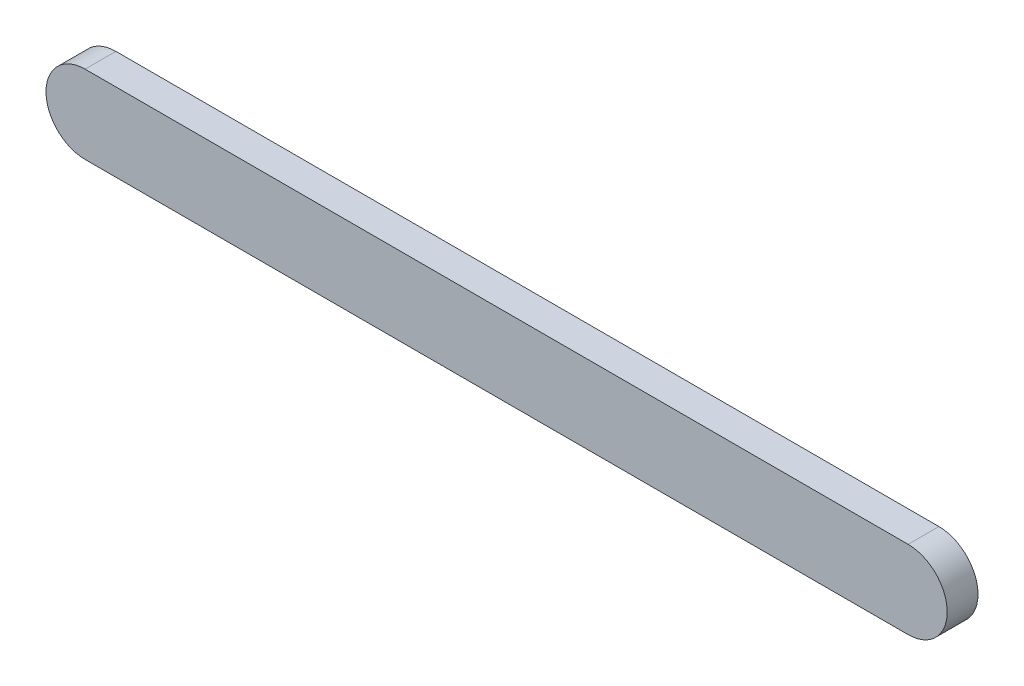
ISO-10303-21;
HEADER;
FILE_DESCRIPTION(('STEP AP214'),'2;1');
FILE_NAME('part.step','',(''),(''),'','','');
FILE_SCHEMA(('AUTOMOTIVE_DESIGN { 1 0 10303 214 1 1 1 1 }'));
ENDSEC;
DATA;
#1=APPLICATION_CONTEXT('core data for automotive mechanical design processes');
#2=APPLICATION_PROTOCOL_DEFINITION('international standard','automotive_design',2000,#1);
#3=PRODUCT_CONTEXT('',#1,'mechanical');
#4=PRODUCT('Part','Part','',(#3));
#5=PRODUCT_RELATED_PRODUCT_CATEGORY('part','',(#4));
#6=PRODUCT_DEFINITION_FORMATION('','',#4);
#7=PRODUCT_DEFINITION_CONTEXT('part definition',#1,'design');
#8=PRODUCT_DEFINITION('design','',#6,#7);
#9=PRODUCT_DEFINITION_SHAPE('','',#8);
#10=(LENGTH_UNIT() NAMED_UNIT(*) SI_UNIT(.MILLI.,.METRE.));
#11=(NAMED_UNIT(*) PLANE_ANGLE_UNIT() SI_UNIT($,.RADIAN.));
#12=(NAMED_UNIT(*) SI_UNIT($,.STERADIAN.) SOLID_ANGLE_UNIT());
#13=UNCERTAINTY_MEASURE_WITH_UNIT(LENGTH_MEASURE(1.E-05),#10,'distance_accuracy_value','');
#14=(GEOMETRIC_REPRESENTATION_CONTEXT(3) GLOBAL_UNCERTAINTY_ASSIGNED_CONTEXT((#13)) GLOBAL_UNIT_ASSIGNED_CONTEXT((#10,
#11,#12)) REPRESENTATION_CONTEXT('',''));
#15=CARTESIAN_POINT('',(0.,0.,0.));
#16=DIRECTION('',(0.,0.,1.));
#17=DIRECTION('',(1.,0.,0.));
#18=AXIS2_PLACEMENT_3D('',#15,#16,#17);
#19=CARTESIAN_POINT('',(89.4842,53.00980254,0.));
#20=DIRECTION('',(0.,1.,0.));
#21=DIRECTION('',(1.,0.,0.));
#22=AXIS2_PLACEMENT_3D('',#19,#20,#21);
#23=PLANE('',#22);
#24=DIRECTION('',(1.,0.,0.));
#25=VECTOR('',#24,1.);
#26=CARTESIAN_POINT('',(89.4842,53.00980254,0.1999996));
#27=LINE('',#26,#25);
#28=CARTESIAN_POINT('',(89.4842,53.00980254,0.1999996));
#29=VERTEX_POINT('',#28);
#30=CARTESIAN_POINT('',(94.8290331,53.00980254,0.1999996));
#31=VERTEX_POINT('',#30);
#32=EDGE_CURVE('E11',#29,#31,#27,.T.);
#33=ORIENTED_EDGE('',*,*,#32,.F.);
#34=DIRECTION('',(0.,0.,1.));
#35=VECTOR('',#34,1.);
#36=CARTESIAN_POINT('',(89.4842,53.00980254,0.));
#37=LINE('',#36,#35);
#38=CARTESIAN_POINT('',(89.4842,53.00980254,0.));
#39=VERTEX_POINT('',#38);
#40=EDGE_CURVE('E24',#39,#29,#37,.T.);
#41=ORIENTED_EDGE('',*,*,#40,.F.);
#42=DIRECTION('',(1.,0.,0.));
#43=VECTOR('',#42,1.);
#44=CARTESIAN_POINT('',(89.4842,53.00980254,0.));
#45=LINE('',#44,#43);
#46=CARTESIAN_POINT('',(94.8290331,53.00980254,0.));
#47=VERTEX_POINT('',#46);
#48=EDGE_CURVE('E75',#39,#47,#45,.T.);
#49=ORIENTED_EDGE('',*,*,#48,.T.);
#50=DIRECTION('',(0.,0.,1.));
#51=VECTOR('',#50,1.);
#52=CARTESIAN_POINT('',(94.8290331,53.00980254,0.));
#53=LINE('',#52,#51);
#54=EDGE_CURVE('E37',#47,#31,#53,.T.);
#55=ORIENTED_EDGE('',*,*,#54,.T.);
#56=EDGE_LOOP('',(#33,#41,#49,#55));
#57=FACE_BOUND('',#56,.T.);
#58=ADVANCED_FACE('F17',(#57),#23,.F.);
#59=CARTESIAN_POINT('',(94.8290331,53.26380254,0.));
#60=DIRECTION('',(0.,0.,-1.));
#61=DIRECTION('',(0.,-1.,0.));
#62=AXIS2_PLACEMENT_3D('',#59,#60,#61);
#63=CYLINDRICAL_SURFACE('',#62,0.254);
#64=CARTESIAN_POINT('',(94.8290331,53.26380254,0.1999996));
#65=DIRECTION('',(0.,0.,1.));
#66=DIRECTION('',(0.,-1.,0.));
#67=AXIS2_PLACEMENT_3D('',#64,#65,#66);
#68=CIRCLE('',#67,0.254);
#69=CARTESIAN_POINT('',(94.8290331,53.51780254,0.1999996));
#70=VERTEX_POINT('',#69);
#71=EDGE_CURVE('E83',#31,#70,#68,.T.);
#72=ORIENTED_EDGE('',*,*,#71,.F.);
#73=ORIENTED_EDGE('',*,*,#54,.F.);
#74=CARTESIAN_POINT('',(94.8290331,53.26380254,0.));
#75=DIRECTION('',(0.,0.,1.));
#76=DIRECTION('',(0.,-1.,0.));
#77=AXIS2_PLACEMENT_3D('',#74,#75,#76);
#78=CIRCLE('',#77,0.254);
#79=CARTESIAN_POINT('',(94.8290331,53.51780254,0.));
#80=VERTEX_POINT('',#79);
#81=EDGE_CURVE('E81',#47,#80,#78,.T.);
#82=ORIENTED_EDGE('',*,*,#81,.T.);
#83=DIRECTION('',(0.,0.,1.));
#84=VECTOR('',#83,1.);
#85=CARTESIAN_POINT('',(94.8290331,53.51780254,0.));
#86=LINE('',#85,#84);
#87=EDGE_CURVE('E67',#80,#70,#86,.T.);
#88=ORIENTED_EDGE('',*,*,#87,.T.);
#89=EDGE_LOOP('',(#72,#73,#82,#88));
#90=FACE_BOUND('',#89,.T.);
#91=ADVANCED_FACE('F89',(#90),#63,.T.);
#92=CARTESIAN_POINT('',(94.8290331,53.51780254,0.));
#93=DIRECTION('',(0.,-1.,0.));
#94=DIRECTION('',(-1.,0.,0.));
#95=AXIS2_PLACEMENT_3D('',#92,#93,#94);
#96=PLANE('',#95);
#97=DIRECTION('',(-1.,0.,0.));
#98=VECTOR('',#97,1.);
#99=CARTESIAN_POINT('',(94.8290331,53.51780254,0.1999996));
#100=LINE('',#99,#98);
#101=CARTESIAN_POINT('',(89.4842,53.51780254,0.1999996));
#102=VERTEX_POINT('',#101);
#103=EDGE_CURVE('E71',#70,#102,#100,.T.);
#104=ORIENTED_EDGE('',*,*,#103,.F.);
#105=ORIENTED_EDGE('',*,*,#87,.F.);
#106=DIRECTION('',(-1.,0.,0.));
#107=VECTOR('',#106,1.);
#108=CARTESIAN_POINT('',(94.8290331,53.51780254,0.));
#109=LINE('',#108,#107);
#110=CARTESIAN_POINT('',(89.4842,53.51780254,0.));
#111=VERTEX_POINT('',#110);
#112=EDGE_CURVE('E63',#80,#111,#109,.T.);
#113=ORIENTED_EDGE('',*,*,#112,.T.);
#114=DIRECTION('',(0.,0.,1.));
#115=VECTOR('',#114,1.);
#116=CARTESIAN_POINT('',(89.4842,53.51780254,0.));
#117=LINE('',#116,#115);
#118=EDGE_CURVE('E53',#111,#102,#117,.T.);
#119=ORIENTED_EDGE('',*,*,#118,.T.);
#120=EDGE_LOOP('',(#104,#105,#113,#119));
#121=FACE_BOUND('',#120,.T.);
#122=ADVANCED_FACE('F66',(#121),#96,.F.);
#123=CARTESIAN_POINT('',(89.4842,53.26380254,0.));
#124=DIRECTION('',(0.,0.,-1.));
#125=DIRECTION('',(0.,1.,0.));
#126=AXIS2_PLACEMENT_3D('',#123,#124,#125);
#127=CYLINDRICAL_SURFACE('',#126,0.254);
#128=CARTESIAN_POINT('',(89.4842,53.26380254,0.1999996));
#129=DIRECTION('',(0.,0.,1.));
#130=DIRECTION('',(0.,1.,0.));
#131=AXIS2_PLACEMENT_3D('',#128,#129,#130);
#132=CIRCLE('',#131,0.254);
#133=EDGE_CURVE('E59',#102,#29,#132,.T.);
#134=ORIENTED_EDGE('',*,*,#133,.F.);
#135=ORIENTED_EDGE('',*,*,#118,.F.);
#136=CARTESIAN_POINT('',(89.4842,53.26380254,0.));
#137=DIRECTION('',(0.,0.,1.));
#138=DIRECTION('',(0.,1.,0.));
#139=AXIS2_PLACEMENT_3D('',#136,#137,#138);
#140=CIRCLE('',#139,0.254);
#141=EDGE_CURVE('E57',#111,#39,#140,.T.);
#142=ORIENTED_EDGE('',*,*,#141,.T.);
#143=ORIENTED_EDGE('',*,*,#40,.T.);
#144=EDGE_LOOP('',(#134,#135,#142,#143));
#145=FACE_BOUND('',#144,.T.);
#146=ADVANCED_FACE('F55',(#145),#127,.T.);
#147=CARTESIAN_POINT('',(89.4842,53.00980254,0.));
#148=DIRECTION('',(0.,0.,-1.));
#149=DIRECTION('',(-1.,0.,0.));
#150=AXIS2_PLACEMENT_3D('',#147,#148,#149);
#151=PLANE('',#150);
#152=ORIENTED_EDGE('',*,*,#141,.F.);
#153=ORIENTED_EDGE('',*,*,#112,.F.);
#154=ORIENTED_EDGE('',*,*,#81,.F.);
#155=ORIENTED_EDGE('',*,*,#48,.F.);
#156=EDGE_LOOP('',(#152,#153,#154,#155));
#157=FACE_BOUND('',#156,.T.);
#158=ADVANCED_FACE('F74',(#157),#151,.T.);
#159=CARTESIAN_POINT('',(89.4842,53.00980254,0.1999996));
#160=DIRECTION('',(0.,0.,-1.));
#161=DIRECTION('',(-1.,0.,0.));
#162=AXIS2_PLACEMENT_3D('',#159,#160,#161);
#163=PLANE('',#162);
#164=ORIENTED_EDGE('',*,*,#32,.T.);
#165=ORIENTED_EDGE('',*,*,#71,.T.);
#166=ORIENTED_EDGE('',*,*,#103,.T.);
#167=ORIENTED_EDGE('',*,*,#133,.T.);
#168=EDGE_LOOP('',(#164,#165,#166,#167));
#169=FACE_BOUND('',#168,.T.);
#170=ADVANCED_FACE('F91',(#169),#163,.F.);
#171=CLOSED_SHELL('',(#58,#91,#122,#146,#158,#170));
#172=MANIFOLD_SOLID_BREP('B1',#171);
#173=ADVANCED_BREP_SHAPE_REPRESENTATION('',(#18,#172),#14);
#174=SHAPE_DEFINITION_REPRESENTATION(#9,#173);
ENDSEC;
END-ISO-10303-21;
